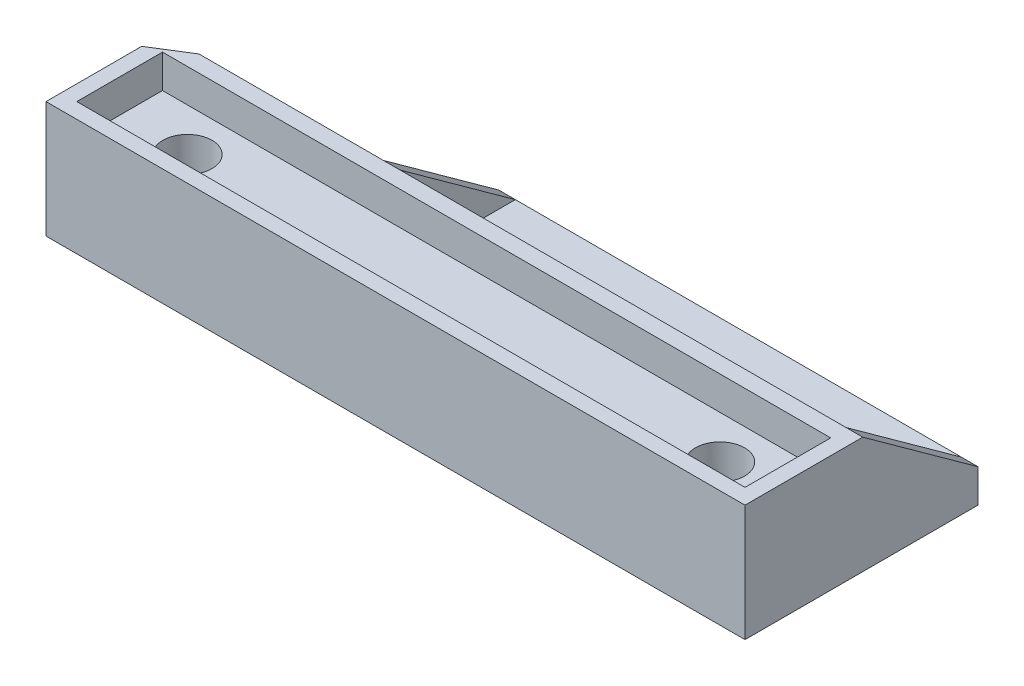
ISO-10303-21;
HEADER;
FILE_DESCRIPTION(('STEP AP214'),'2;1');
FILE_NAME('part.step','',(''),(''),'','','');
FILE_SCHEMA(('AUTOMOTIVE_DESIGN { 1 0 10303 214 1 1 1 1 }'));
ENDSEC;
DATA;
#1=APPLICATION_CONTEXT('core data for automotive mechanical design processes');
#2=APPLICATION_PROTOCOL_DEFINITION('international standard','automotive_design',2000,#1);
#3=PRODUCT_CONTEXT('',#1,'mechanical');
#4=PRODUCT('Part','Part','',(#3));
#5=PRODUCT_RELATED_PRODUCT_CATEGORY('part','',(#4));
#6=PRODUCT_DEFINITION_FORMATION('','',#4);
#7=PRODUCT_DEFINITION_CONTEXT('part definition',#1,'design');
#8=PRODUCT_DEFINITION('design','',#6,#7);
#9=PRODUCT_DEFINITION_SHAPE('','',#8);
#10=(LENGTH_UNIT() NAMED_UNIT(*) SI_UNIT(.MILLI.,.METRE.));
#11=(NAMED_UNIT(*) PLANE_ANGLE_UNIT() SI_UNIT($,.RADIAN.));
#12=(NAMED_UNIT(*) SI_UNIT($,.STERADIAN.) SOLID_ANGLE_UNIT());
#13=UNCERTAINTY_MEASURE_WITH_UNIT(LENGTH_MEASURE(1.E-05),#10,'distance_accuracy_value','');
#14=(GEOMETRIC_REPRESENTATION_CONTEXT(3) GLOBAL_UNCERTAINTY_ASSIGNED_CONTEXT((#13)) GLOBAL_UNIT_ASSIGNED_CONTEXT((#10,
#11,#12)) REPRESENTATION_CONTEXT('',''));
#15=CARTESIAN_POINT('',(0.,0.,0.));
#16=DIRECTION('',(0.,0.,1.));
#17=DIRECTION('',(1.,0.,0.));
#18=AXIS2_PLACEMENT_3D('',#15,#16,#17);
#19=CARTESIAN_POINT('',(5.,7.,-3.49999999993634));
#20=DIRECTION('',(0.,-1.,0.));
#21=DIRECTION('',(0.,0.,-1.));
#22=AXIS2_PLACEMENT_3D('',#19,#20,#21);
#23=CYLINDRICAL_SURFACE('',#22,1.47500000000001);
#24=CARTESIAN_POINT('',(5.,0.,-3.49999999993634));
#25=DIRECTION('',(0.,-1.,0.));
#26=DIRECTION('',(0.,0.,1.));
#27=AXIS2_PLACEMENT_3D('',#24,#25,#26);
#28=CIRCLE('',#27,1.47500000000001);
#29=CARTESIAN_POINT('',(5.,0.,-2.02499999993633));
#30=VERTEX_POINT('',#29);
#31=EDGE_CURVE('E249',#30,#30,#28,.T.);
#32=ORIENTED_EDGE('',*,*,#31,.T.);
#33=EDGE_LOOP('',(#32));
#34=FACE_BOUND('',#33,.T.);
#35=CARTESIAN_POINT('',(5.,5.,-3.49999999993634));
#36=DIRECTION('',(0.,1.,0.));
#37=DIRECTION('',(0.,0.,1.));
#38=AXIS2_PLACEMENT_3D('',#35,#36,#37);
#39=CIRCLE('',#38,1.47500000000001);
#40=CARTESIAN_POINT('',(5.,5.,-2.02499999993633));
#41=VERTEX_POINT('',#40);
#42=EDGE_CURVE('E245',#41,#41,#39,.F.);
#43=ORIENTED_EDGE('',*,*,#42,.F.);
#44=EDGE_LOOP('',(#43));
#45=FACE_BOUND('',#44,.T.);
#46=ADVANCED_FACE('F45',(#34,#45),#23,.F.);
#47=CARTESIAN_POINT('',(37.,7.,-3.49999999993633));
#48=DIRECTION('',(0.,-1.,0.));
#49=DIRECTION('',(0.,0.,-1.));
#50=AXIS2_PLACEMENT_3D('',#47,#48,#49);
#51=CYLINDRICAL_SURFACE('',#50,1.47500000000001);
#52=CARTESIAN_POINT('',(37.,0.,-3.49999999993633));
#53=DIRECTION('',(0.,-1.,0.));
#54=DIRECTION('',(0.,0.,-1.));
#55=AXIS2_PLACEMENT_3D('',#52,#53,#54);
#56=CIRCLE('',#55,1.47500000000001);
#57=CARTESIAN_POINT('',(37.,0.,-4.97499999993634));
#58=VERTEX_POINT('',#57);
#59=EDGE_CURVE('E250',#58,#58,#56,.T.);
#60=ORIENTED_EDGE('',*,*,#59,.T.);
#61=EDGE_LOOP('',(#60));
#62=FACE_BOUND('',#61,.T.);
#63=CARTESIAN_POINT('',(37.,5.,-3.49999999993633));
#64=DIRECTION('',(0.,1.,0.));
#65=DIRECTION('',(0.,0.,1.));
#66=AXIS2_PLACEMENT_3D('',#63,#64,#65);
#67=CIRCLE('',#66,1.47500000000001);
#68=CARTESIAN_POINT('',(37.,5.,-2.02499999993632));
#69=VERTEX_POINT('',#68);
#70=EDGE_CURVE('E235',#69,#69,#67,.F.);
#71=ORIENTED_EDGE('',*,*,#70,.F.);
#72=EDGE_LOOP('',(#71));
#73=FACE_BOUND('',#72,.T.);
#74=ADVANCED_FACE('F426',(#62,#73),#51,.F.);
#75=CARTESIAN_POINT('',(42.,7.,-6.99999999987266));
#76=DIRECTION('',(-1.,0.,0.));
#77=DIRECTION('',(0.,0.,1.));
#78=AXIS2_PLACEMENT_3D('',#75,#76,#77);
#79=PLANE('',#78);
#80=DIRECTION('',(0.,-1.,0.));
#81=VECTOR('',#80,1.);
#82=CARTESIAN_POINT('',(42.,7.,-13.9999999998727));
#83=LINE('',#82,#81);
#84=CARTESIAN_POINT('',(42.,2.,-13.9999999998727));
#85=VERTEX_POINT('',#84);
#86=CARTESIAN_POINT('',(42.,0.,-13.9999999998727));
#87=VERTEX_POINT('',#86);
#88=EDGE_CURVE('E181',#85,#87,#83,.T.);
#89=ORIENTED_EDGE('',*,*,#88,.F.);
#90=DIRECTION('',(0.,0.585383683581828,0.810756401760831));
#91=VECTOR('',#90,1.);
#92=CARTESIAN_POINT('',(42.,7.,-7.07499999987266));
#93=LINE('',#92,#91);
#94=CARTESIAN_POINT('',(42.,7.,-7.07499999987266));
#95=VERTEX_POINT('',#94);
#96=EDGE_CURVE('E161',#85,#95,#93,.T.);
#97=ORIENTED_EDGE('',*,*,#96,.T.);
#98=DIRECTION('',(0.,0.,-1.));
#99=VECTOR('',#98,1.);
#100=CARTESIAN_POINT('',(42.,7.,-6.99999999987266));
#101=LINE('',#100,#99);
#102=CARTESIAN_POINT('',(42.,7.,0.));
#103=VERTEX_POINT('',#102);
#104=EDGE_CURVE('E257',#103,#95,#101,.T.);
#105=ORIENTED_EDGE('',*,*,#104,.F.);
#106=DIRECTION('',(0.,-1.,0.));
#107=VECTOR('',#106,1.);
#108=CARTESIAN_POINT('',(42.,7.,0.));
#109=LINE('',#108,#107);
#110=CARTESIAN_POINT('',(42.,0.,0.));
#111=VERTEX_POINT('',#110);
#112=EDGE_CURVE('E270',#103,#111,#109,.T.);
#113=ORIENTED_EDGE('',*,*,#112,.T.);
#114=DIRECTION('',(0.,0.,-1.));
#115=VECTOR('',#114,1.);
#116=CARTESIAN_POINT('',(42.,0.,-6.99999999987266));
#117=LINE('',#116,#115);
#118=EDGE_CURVE('E192',#111,#87,#117,.T.);
#119=ORIENTED_EDGE('',*,*,#118,.T.);
#120=EDGE_LOOP('',(#89,#97,#105,#113,#119));
#121=FACE_BOUND('',#120,.T.);
#122=ADVANCED_FACE('F189',(#121),#79,.F.);
#123=CARTESIAN_POINT('',(0.,7.,-5.75));
#124=DIRECTION('',(0.529919264233527,0.,0.848048096156224));
#125=DIRECTION('',(0.848048096156224,0.,-0.529919264233527));
#126=AXIS2_PLACEMENT_3D('',#123,#124,#125);
#127=PLANE('',#126);
#128=DIRECTION('',(-0.848048096156224,0.,0.529919264233527));
#129=VECTOR('',#128,1.);
#130=CARTESIAN_POINT('',(0.,7.,-5.75));
#131=LINE('',#130,#129);
#132=CARTESIAN_POINT('',(2.12044325077533,7.,-7.07499999987266));
#133=VERTEX_POINT('',#132);
#134=CARTESIAN_POINT('',(0.,7.,-5.75));
#135=VERTEX_POINT('',#134);
#136=EDGE_CURVE('E260',#133,#135,#131,.T.);
#137=ORIENTED_EDGE('',*,*,#136,.F.);
#138=DIRECTION('',(0.,1.,0.));
#139=VECTOR('',#138,1.);
#140=CARTESIAN_POINT('',(2.12044325077533,2.,-7.07499999987266));
#141=LINE('',#140,#139);
#142=CARTESIAN_POINT('',(2.12044325077533,3.,-7.07499999987266));
#143=VERTEX_POINT('',#142);
#144=EDGE_CURVE('E328',#143,#133,#141,.T.);
#145=ORIENTED_EDGE('',*,*,#144,.F.);
#146=DIRECTION('',(-0.749337346632538,0.468237942152119,0.468237942152125));
#147=VECTOR('',#146,1.);
#148=CARTESIAN_POINT('',(-0.938572373960924,4.91148511091009,-5.16351488896254));
#149=LINE('',#148,#147);
#150=CARTESIAN_POINT('',(3.72077777981619,2.,-8.07499999987267));
#151=VERTEX_POINT('',#150);
#152=EDGE_CURVE('E11',#143,#151,#149,.F.);
#153=ORIENTED_EDGE('',*,*,#152,.T.);
#154=DIRECTION('',(-0.848048096156395,0.,0.529919264233255));
#155=VECTOR('',#154,1.);
#156=CARTESIAN_POINT('',(13.2027598643832,2.,-13.9999999998727));
#157=LINE('',#156,#155);
#158=CARTESIAN_POINT('',(13.2027598643832,2.,-13.9999999998727));
#159=VERTEX_POINT('',#158);
#160=EDGE_CURVE('E320',#159,#151,#157,.T.);
#161=ORIENTED_EDGE('',*,*,#160,.F.);
#162=DIRECTION('',(0.,-1.,0.));
#163=VECTOR('',#162,1.);
#164=CARTESIAN_POINT('',(13.2027598643832,7.,-13.9999999998727));
#165=LINE('',#164,#163);
#166=CARTESIAN_POINT('',(13.2027598643832,0.,-13.9999999998727));
#167=VERTEX_POINT('',#166);
#168=EDGE_CURVE('E196',#159,#167,#165,.T.);
#169=ORIENTED_EDGE('',*,*,#168,.T.);
#170=DIRECTION('',(-0.848048096156224,0.,0.529919264233527));
#171=VECTOR('',#170,1.);
#172=CARTESIAN_POINT('',(0.,0.,-5.75));
#173=LINE('',#172,#171);
#174=CARTESIAN_POINT('',(0.,0.,-5.75));
#175=VERTEX_POINT('',#174);
#176=EDGE_CURVE('E273',#167,#175,#173,.T.);
#177=ORIENTED_EDGE('',*,*,#176,.T.);
#178=DIRECTION('',(0.,-1.,0.));
#179=VECTOR('',#178,1.);
#180=CARTESIAN_POINT('',(0.,7.,-5.75));
#181=LINE('',#180,#179);
#182=EDGE_CURVE('E287',#135,#175,#181,.T.);
#183=ORIENTED_EDGE('',*,*,#182,.F.);
#184=EDGE_LOOP('',(#137,#145,#153,#161,#169,#177,#183));
#185=FACE_BOUND('',#184,.T.);
#186=ADVANCED_FACE('F396',(#185),#127,.F.);
#187=CARTESIAN_POINT('',(0.,7.,-5.75));
#188=DIRECTION('',(1.,0.,0.));
#189=DIRECTION('',(0.,0.,-1.));
#190=AXIS2_PLACEMENT_3D('',#187,#188,#189);
#191=PLANE('',#190);
#192=DIRECTION('',(0.,0.,1.));
#193=VECTOR('',#192,1.);
#194=CARTESIAN_POINT('',(0.,0.,-5.75));
#195=LINE('',#194,#193);
#196=CARTESIAN_POINT('',(0.,0.,0.));
#197=VERTEX_POINT('',#196);
#198=EDGE_CURVE('E276',#175,#197,#195,.T.);
#199=ORIENTED_EDGE('',*,*,#198,.T.);
#200=DIRECTION('',(0.,-1.,0.));
#201=VECTOR('',#200,1.);
#202=CARTESIAN_POINT('',(0.,7.,0.));
#203=LINE('',#202,#201);
#204=CARTESIAN_POINT('',(0.,7.,0.));
#205=VERTEX_POINT('',#204);
#206=EDGE_CURVE('E283',#205,#197,#203,.T.);
#207=ORIENTED_EDGE('',*,*,#206,.F.);
#208=DIRECTION('',(0.,0.,1.));
#209=VECTOR('',#208,1.);
#210=CARTESIAN_POINT('',(0.,7.,-5.75));
#211=LINE('',#210,#209);
#212=EDGE_CURVE('E264',#135,#205,#211,.T.);
#213=ORIENTED_EDGE('',*,*,#212,.F.);
#214=ORIENTED_EDGE('',*,*,#182,.T.);
#215=EDGE_LOOP('',(#199,#207,#213,#214));
#216=FACE_BOUND('',#215,.T.);
#217=ADVANCED_FACE('F402',(#216),#191,.F.);
#218=CARTESIAN_POINT('',(0.,7.,0.));
#219=DIRECTION('',(0.,0.,-1.));
#220=DIRECTION('',(-1.,0.,0.));
#221=AXIS2_PLACEMENT_3D('',#218,#219,#220);
#222=PLANE('',#221);
#223=DIRECTION('',(1.,0.,0.));
#224=VECTOR('',#223,1.);
#225=CARTESIAN_POINT('',(0.,0.,0.));
#226=LINE('',#225,#224);
#227=EDGE_CURVE('E261',#197,#111,#226,.T.);
#228=ORIENTED_EDGE('',*,*,#227,.T.);
#229=ORIENTED_EDGE('',*,*,#112,.F.);
#230=DIRECTION('',(1.,0.,0.));
#231=VECTOR('',#230,1.);
#232=CARTESIAN_POINT('',(0.,7.,0.));
#233=LINE('',#232,#231);
#234=EDGE_CURVE('E267',#205,#103,#233,.T.);
#235=ORIENTED_EDGE('',*,*,#234,.F.);
#236=ORIENTED_EDGE('',*,*,#206,.T.);
#237=EDGE_LOOP('',(#228,#229,#235,#236));
#238=FACE_BOUND('',#237,.T.);
#239=ADVANCED_FACE('F406',(#238),#222,.F.);
#240=CARTESIAN_POINT('',(0.,7.,0.));
#241=DIRECTION('',(0.,1.,0.));
#242=DIRECTION('',(0.,0.,1.));
#243=AXIS2_PLACEMENT_3D('',#240,#241,#242);
#244=PLANE('',#243);
#245=DIRECTION('',(-1.,0.,0.));
#246=VECTOR('',#245,1.);
#247=CARTESIAN_POINT('',(42.,7.,-7.07499999987266));
#248=LINE('',#247,#246);
#249=CARTESIAN_POINT('',(14.2027598643832,7.,-7.07499999987266));
#250=VERTEX_POINT('',#249);
#251=CARTESIAN_POINT('',(13.2027598643832,7.,-7.07499999987266));
#252=VERTEX_POINT('',#251);
#253=EDGE_CURVE('E187',#250,#252,#248,.T.);
#254=ORIENTED_EDGE('',*,*,#253,.T.);
#255=DIRECTION('',(1.,0.,0.));
#256=VECTOR('',#255,1.);
#257=CARTESIAN_POINT('',(2.12044325077533,7.,-7.07499999987266));
#258=LINE('',#257,#256);
#259=EDGE_CURVE('E332',#133,#252,#258,.T.);
#260=ORIENTED_EDGE('',*,*,#259,.F.);
#261=ORIENTED_EDGE('',*,*,#136,.T.);
#262=ORIENTED_EDGE('',*,*,#212,.T.);
#263=ORIENTED_EDGE('',*,*,#234,.T.);
#264=ORIENTED_EDGE('',*,*,#104,.T.);
#265=CARTESIAN_POINT('',(41.,7.,-7.07499999987266));
#266=VERTEX_POINT('',#265);
#267=EDGE_CURVE('E168',#95,#266,#248,.T.);
#268=ORIENTED_EDGE('',*,*,#267,.T.);
#269=DIRECTION('',(1.,0.,0.));
#270=VECTOR('',#269,1.);
#271=CARTESIAN_POINT('',(41.,7.,-7.07499999987266));
#272=LINE('',#271,#270);
#273=EDGE_CURVE('E351',#250,#266,#272,.T.);
#274=ORIENTED_EDGE('',*,*,#273,.F.);
#275=EDGE_LOOP('',(#254,#260,#261,#262,#263,#264,#268,#274));
#276=FACE_BOUND('',#275,.T.);
#277=DIRECTION('',(0.,0.,1.));
#278=VECTOR('',#277,1.);
#279=CARTESIAN_POINT('',(0.925000000000002,7.,-6.07499999987266));
#280=LINE('',#279,#278);
#281=CARTESIAN_POINT('',(0.925000000000002,7.,-6.07499999987266));
#282=VERTEX_POINT('',#281);
#283=CARTESIAN_POINT('',(0.925000000000003,7.,-0.924999999872662));
#284=VERTEX_POINT('',#283);
#285=EDGE_CURVE('E195',#282,#284,#280,.T.);
#286=ORIENTED_EDGE('',*,*,#285,.F.);
#287=DIRECTION('',(1.,0.,0.));
#288=VECTOR('',#287,1.);
#289=CARTESIAN_POINT('',(0.925000000000002,7.,-6.07499999987266));
#290=LINE('',#289,#288);
#291=CARTESIAN_POINT('',(41.075,7.,-6.07499999987266));
#292=VERTEX_POINT('',#291);
#293=EDGE_CURVE('E211',#282,#292,#290,.T.);
#294=ORIENTED_EDGE('',*,*,#293,.T.);
#295=DIRECTION('',(0.,0.,1.));
#296=VECTOR('',#295,1.);
#297=CARTESIAN_POINT('',(41.075,7.,-6.07499999987266));
#298=LINE('',#297,#296);
#299=CARTESIAN_POINT('',(41.075,7.,-0.924999999872662));
#300=VERTEX_POINT('',#299);
#301=EDGE_CURVE('E225',#292,#300,#298,.T.);
#302=ORIENTED_EDGE('',*,*,#301,.T.);
#303=DIRECTION('',(1.,0.,0.));
#304=VECTOR('',#303,1.);
#305=CARTESIAN_POINT('',(0.925000000000003,7.,-0.924999999872662));
#306=LINE('',#305,#304);
#307=EDGE_CURVE('E200',#284,#300,#306,.T.);
#308=ORIENTED_EDGE('',*,*,#307,.F.);
#309=EDGE_LOOP('',(#286,#294,#302,#308));
#310=FACE_BOUND('',#309,.T.);
#311=ADVANCED_FACE('F392',(#276,#310),#244,.T.);
#312=CARTESIAN_POINT('',(0.,0.,0.));
#313=DIRECTION('',(0.,1.,0.));
#314=DIRECTION('',(0.,0.,1.));
#315=AXIS2_PLACEMENT_3D('',#312,#313,#314);
#316=PLANE('',#315);
#317=ORIENTED_EDGE('',*,*,#59,.F.);
#318=EDGE_LOOP('',(#317));
#319=FACE_BOUND('',#318,.T.);
#320=ORIENTED_EDGE('',*,*,#31,.F.);
#321=EDGE_LOOP('',(#320));
#322=FACE_BOUND('',#321,.T.);
#323=ORIENTED_EDGE('',*,*,#118,.F.);
#324=ORIENTED_EDGE('',*,*,#227,.F.);
#325=ORIENTED_EDGE('',*,*,#198,.F.);
#326=ORIENTED_EDGE('',*,*,#176,.F.);
#327=DIRECTION('',(-1.,0.,0.));
#328=VECTOR('',#327,1.);
#329=CARTESIAN_POINT('',(42.,0.,-13.9999999998727));
#330=LINE('',#329,#328);
#331=EDGE_CURVE('E202',#87,#167,#330,.T.);
#332=ORIENTED_EDGE('',*,*,#331,.F.);
#333=EDGE_LOOP('',(#323,#324,#325,#326,#332));
#334=FACE_BOUND('',#333,.T.);
#335=ADVANCED_FACE('F409',(#319,#322,#334),#316,.F.);
#336=CARTESIAN_POINT('',(0.,5.,0.));
#337=DIRECTION('',(0.,1.,0.));
#338=DIRECTION('',(0.,0.,1.));
#339=AXIS2_PLACEMENT_3D('',#336,#337,#338);
#340=PLANE('',#339);
#341=DIRECTION('',(0.,0.,1.));
#342=VECTOR('',#341,1.);
#343=CARTESIAN_POINT('',(0.925000000000002,5.,-6.07499999987266));
#344=LINE('',#343,#342);
#345=CARTESIAN_POINT('',(0.925000000000002,5.,-6.07499999987266));
#346=VERTEX_POINT('',#345);
#347=CARTESIAN_POINT('',(0.925000000000003,5.,-0.924999999872662));
#348=VERTEX_POINT('',#347);
#349=EDGE_CURVE('E206',#346,#348,#344,.T.);
#350=ORIENTED_EDGE('',*,*,#349,.T.);
#351=DIRECTION('',(1.,0.,0.));
#352=VECTOR('',#351,1.);
#353=CARTESIAN_POINT('',(0.925000000000003,5.,-0.924999999872662));
#354=LINE('',#353,#352);
#355=CARTESIAN_POINT('',(41.075,5.,-0.924999999872662));
#356=VERTEX_POINT('',#355);
#357=EDGE_CURVE('E210',#348,#356,#354,.T.);
#358=ORIENTED_EDGE('',*,*,#357,.T.);
#359=DIRECTION('',(0.,0.,1.));
#360=VECTOR('',#359,1.);
#361=CARTESIAN_POINT('',(41.075,5.,-6.07499999987266));
#362=LINE('',#361,#360);
#363=CARTESIAN_POINT('',(41.075,5.,-6.07499999987266));
#364=VERTEX_POINT('',#363);
#365=EDGE_CURVE('E215',#364,#356,#362,.T.);
#366=ORIENTED_EDGE('',*,*,#365,.F.);
#367=DIRECTION('',(1.,0.,0.));
#368=VECTOR('',#367,1.);
#369=CARTESIAN_POINT('',(0.925000000000002,5.,-6.07499999987266));
#370=LINE('',#369,#368);
#371=EDGE_CURVE('E218',#346,#364,#370,.T.);
#372=ORIENTED_EDGE('',*,*,#371,.F.);
#373=EDGE_LOOP('',(#350,#358,#366,#372));
#374=FACE_BOUND('',#373,.T.);
#375=ORIENTED_EDGE('',*,*,#70,.T.);
#376=EDGE_LOOP('',(#375));
#377=FACE_BOUND('',#376,.T.);
#378=ORIENTED_EDGE('',*,*,#42,.T.);
#379=EDGE_LOOP('',(#378));
#380=FACE_BOUND('',#379,.T.);
#381=ADVANCED_FACE('F411',(#374,#377,#380),#340,.T.);
#382=CARTESIAN_POINT('',(0.925000000000002,5.,-6.07499999987266));
#383=DIRECTION('',(-1.,0.,0.));
#384=DIRECTION('',(0.,0.,1.));
#385=AXIS2_PLACEMENT_3D('',#382,#383,#384);
#386=PLANE('',#385);
#387=ORIENTED_EDGE('',*,*,#285,.T.);
#388=DIRECTION('',(0.,1.,0.));
#389=VECTOR('',#388,1.);
#390=CARTESIAN_POINT('',(0.925000000000003,5.,-0.924999999872662));
#391=LINE('',#390,#389);
#392=EDGE_CURVE('E220',#348,#284,#391,.T.);
#393=ORIENTED_EDGE('',*,*,#392,.F.);
#394=ORIENTED_EDGE('',*,*,#349,.F.);
#395=DIRECTION('',(0.,1.,0.));
#396=VECTOR('',#395,1.);
#397=CARTESIAN_POINT('',(0.925000000000002,5.,-6.07499999987266));
#398=LINE('',#397,#396);
#399=EDGE_CURVE('E232',#346,#282,#398,.T.);
#400=ORIENTED_EDGE('',*,*,#399,.T.);
#401=EDGE_LOOP('',(#387,#393,#394,#400));
#402=FACE_BOUND('',#401,.T.);
#403=ADVANCED_FACE('F418',(#402),#386,.F.);
#404=CARTESIAN_POINT('',(0.925000000000002,5.,-6.07499999987266));
#405=DIRECTION('',(0.,0.,1.));
#406=DIRECTION('',(1.,0.,0.));
#407=AXIS2_PLACEMENT_3D('',#404,#405,#406);
#408=PLANE('',#407);
#409=ORIENTED_EDGE('',*,*,#293,.F.);
#410=ORIENTED_EDGE('',*,*,#399,.F.);
#411=ORIENTED_EDGE('',*,*,#371,.T.);
#412=DIRECTION('',(0.,1.,0.));
#413=VECTOR('',#412,1.);
#414=CARTESIAN_POINT('',(41.075,5.,-6.07499999987266));
#415=LINE('',#414,#413);
#416=EDGE_CURVE('E236',#364,#292,#415,.T.);
#417=ORIENTED_EDGE('',*,*,#416,.T.);
#418=EDGE_LOOP('',(#409,#410,#411,#417));
#419=FACE_BOUND('',#418,.T.);
#420=ADVANCED_FACE('F438',(#419),#408,.T.);
#421=CARTESIAN_POINT('',(41.075,5.,-6.07499999987266));
#422=DIRECTION('',(-1.,0.,0.));
#423=DIRECTION('',(0.,0.,1.));
#424=AXIS2_PLACEMENT_3D('',#421,#422,#423);
#425=PLANE('',#424);
#426=ORIENTED_EDGE('',*,*,#301,.F.);
#427=ORIENTED_EDGE('',*,*,#416,.F.);
#428=ORIENTED_EDGE('',*,*,#365,.T.);
#429=DIRECTION('',(0.,1.,0.));
#430=VECTOR('',#429,1.);
#431=CARTESIAN_POINT('',(41.075,5.,-0.924999999872662));
#432=LINE('',#431,#430);
#433=EDGE_CURVE('E239',#356,#300,#432,.T.);
#434=ORIENTED_EDGE('',*,*,#433,.T.);
#435=EDGE_LOOP('',(#426,#427,#428,#434));
#436=FACE_BOUND('',#435,.T.);
#437=ADVANCED_FACE('F443',(#436),#425,.T.);
#438=CARTESIAN_POINT('',(0.925000000000003,5.,-0.924999999872662));
#439=DIRECTION('',(0.,0.,1.));
#440=DIRECTION('',(1.,0.,0.));
#441=AXIS2_PLACEMENT_3D('',#438,#439,#440);
#442=PLANE('',#441);
#443=ORIENTED_EDGE('',*,*,#307,.T.);
#444=ORIENTED_EDGE('',*,*,#433,.F.);
#445=ORIENTED_EDGE('',*,*,#357,.F.);
#446=ORIENTED_EDGE('',*,*,#392,.T.);
#447=EDGE_LOOP('',(#443,#444,#445,#446));
#448=FACE_BOUND('',#447,.T.);
#449=ADVANCED_FACE('F440',(#448),#442,.F.);
#450=CARTESIAN_POINT('',(42.,7.,-13.9999999998727));
#451=DIRECTION('',(0.,0.,1.));
#452=DIRECTION('',(1.,0.,0.));
#453=AXIS2_PLACEMENT_3D('',#450,#451,#452);
#454=PLANE('',#453);
#455=ORIENTED_EDGE('',*,*,#168,.F.);
#456=DIRECTION('',(-1.,0.,0.));
#457=VECTOR('',#456,1.);
#458=CARTESIAN_POINT('',(42.,2.,-13.9999999998727));
#459=LINE('',#458,#457);
#460=CARTESIAN_POINT('',(14.2027598643832,2.,-13.9999999998727));
#461=VERTEX_POINT('',#460);
#462=EDGE_CURVE('E174',#461,#159,#459,.T.);
#463=ORIENTED_EDGE('',*,*,#462,.F.);
#464=DIRECTION('',(-1.,0.,0.));
#465=VECTOR('',#464,1.);
#466=CARTESIAN_POINT('',(14.2027598643832,2.,-13.9999999998727));
#467=LINE('',#466,#465);
#468=CARTESIAN_POINT('',(41.,2.,-13.9999999998727));
#469=VERTEX_POINT('',#468);
#470=EDGE_CURVE('E185',#469,#461,#467,.T.);
#471=ORIENTED_EDGE('',*,*,#470,.F.);
#472=EDGE_CURVE('E165',#85,#469,#459,.T.);
#473=ORIENTED_EDGE('',*,*,#472,.F.);
#474=ORIENTED_EDGE('',*,*,#88,.T.);
#475=ORIENTED_EDGE('',*,*,#331,.T.);
#476=EDGE_LOOP('',(#455,#463,#471,#473,#474,#475));
#477=FACE_BOUND('',#476,.T.);
#478=ADVANCED_FACE('F179',(#477),#454,.F.);
#479=CARTESIAN_POINT('',(13.2027598643832,2.,-7.07499999987266));
#480=DIRECTION('',(1.,0.,0.));
#481=DIRECTION('',(0.,0.,-1.));
#482=AXIS2_PLACEMENT_3D('',#479,#480,#481);
#483=PLANE('',#482);
#484=DIRECTION('',(0.,0.,-1.));
#485=VECTOR('',#484,1.);
#486=CARTESIAN_POINT('',(13.2027598643832,2.,-7.07499999987266));
#487=LINE('',#486,#485);
#488=CARTESIAN_POINT('',(13.2027598643832,2.,-8.07499999987267));
#489=VERTEX_POINT('',#488);
#490=EDGE_CURVE('E317',#489,#159,#487,.T.);
#491=ORIENTED_EDGE('',*,*,#490,.F.);
#492=DIRECTION('',(0.,-0.707106781186543,-0.707106781186552));
#493=VECTOR('',#492,1.);
#494=CARTESIAN_POINT('',(13.2027598643832,2.,-8.07499999987267));
#495=LINE('',#494,#493);
#496=CARTESIAN_POINT('',(13.2027598643832,3.,-7.07499999987266));
#497=VERTEX_POINT('',#496);
#498=EDGE_CURVE('E69',#489,#497,#495,.F.);
#499=ORIENTED_EDGE('',*,*,#498,.T.);
#500=DIRECTION('',(0.,1.,0.));
#501=VECTOR('',#500,1.);
#502=CARTESIAN_POINT('',(13.2027598643832,2.,-7.07499999987266));
#503=LINE('',#502,#501);
#504=EDGE_CURVE('E334',#497,#252,#503,.T.);
#505=ORIENTED_EDGE('',*,*,#504,.T.);
#506=DIRECTION('',(0.,-0.585383683581828,-0.810756401760832));
#507=VECTOR('',#506,1.);
#508=CARTESIAN_POINT('',(13.2027598643832,5.28662971498086,-9.44801784462418));
#509=LINE('',#508,#507);
#510=EDGE_CURVE('E326',#252,#159,#509,.T.);
#511=ORIENTED_EDGE('',*,*,#510,.T.);
#512=EDGE_LOOP('',(#491,#499,#505,#511));
#513=FACE_BOUND('',#512,.T.);
#514=ADVANCED_FACE('F324',(#513),#483,.F.);
#515=CARTESIAN_POINT('',(2.12044325077533,2.,-7.07499999987266));
#516=DIRECTION('',(0.,0.,1.));
#517=DIRECTION('',(1.,0.,0.));
#518=AXIS2_PLACEMENT_3D('',#515,#516,#517);
#519=PLANE('',#518);
#520=ORIENTED_EDGE('',*,*,#504,.F.);
#521=DIRECTION('',(-1.,0.,0.));
#522=VECTOR('',#521,1.);
#523=CARTESIAN_POINT('',(2.12044325077533,3.,-7.07499999987266));
#524=LINE('',#523,#522);
#525=EDGE_CURVE('E55',#497,#143,#524,.T.);
#526=ORIENTED_EDGE('',*,*,#525,.T.);
#527=ORIENTED_EDGE('',*,*,#144,.T.);
#528=ORIENTED_EDGE('',*,*,#259,.T.);
#529=EDGE_LOOP('',(#520,#526,#527,#528));
#530=FACE_BOUND('',#529,.T.);
#531=ADVANCED_FACE('F390',(#530),#519,.F.);
#532=CARTESIAN_POINT('',(0.,2.,0.));
#533=DIRECTION('',(0.,-1.,0.));
#534=DIRECTION('',(0.,0.,-1.));
#535=AXIS2_PLACEMENT_3D('',#532,#533,#534);
#536=PLANE('',#535);
#537=ORIENTED_EDGE('',*,*,#160,.T.);
#538=DIRECTION('',(1.,0.,0.));
#539=VECTOR('',#538,1.);
#540=CARTESIAN_POINT('',(13.2027598643832,2.,-8.07499999987267));
#541=LINE('',#540,#539);
#542=EDGE_CURVE('E307',#151,#489,#541,.T.);
#543=ORIENTED_EDGE('',*,*,#542,.T.);
#544=ORIENTED_EDGE('',*,*,#490,.T.);
#545=EDGE_LOOP('',(#537,#543,#544));
#546=FACE_BOUND('',#545,.T.);
#547=ADVANCED_FACE('F316',(#546),#536,.F.);
#548=CARTESIAN_POINT('',(41.,2.,-7.07499999987266));
#549=DIRECTION('',(0.,0.,1.));
#550=DIRECTION('',(1.,0.,0.));
#551=AXIS2_PLACEMENT_3D('',#548,#549,#550);
#552=PLANE('',#551);
#553=DIRECTION('',(0.,1.,0.));
#554=VECTOR('',#553,1.);
#555=CARTESIAN_POINT('',(41.,2.,-7.07499999987266));
#556=LINE('',#555,#554);
#557=CARTESIAN_POINT('',(41.,2.99999999999999,-7.07499999987266));
#558=VERTEX_POINT('',#557);
#559=EDGE_CURVE('E341',#558,#266,#556,.T.);
#560=ORIENTED_EDGE('',*,*,#559,.F.);
#561=DIRECTION('',(-1.,0.,0.));
#562=VECTOR('',#561,1.);
#563=CARTESIAN_POINT('',(14.2027598643832,2.99999999999999,-7.07499999987266));
#564=LINE('',#563,#562);
#565=CARTESIAN_POINT('',(14.2027598643832,2.99999999999999,-7.07499999987266));
#566=VERTEX_POINT('',#565);
#567=EDGE_CURVE('E301',#558,#566,#564,.T.);
#568=ORIENTED_EDGE('',*,*,#567,.T.);
#569=DIRECTION('',(0.,1.,0.));
#570=VECTOR('',#569,1.);
#571=CARTESIAN_POINT('',(14.2027598643832,2.,-7.07499999987266));
#572=LINE('',#571,#570);
#573=EDGE_CURVE('E339',#566,#250,#572,.T.);
#574=ORIENTED_EDGE('',*,*,#573,.T.);
#575=ORIENTED_EDGE('',*,*,#273,.T.);
#576=EDGE_LOOP('',(#560,#568,#574,#575));
#577=FACE_BOUND('',#576,.T.);
#578=ADVANCED_FACE('F382',(#577),#552,.F.);
#579=CARTESIAN_POINT('',(14.2027598643832,2.,-7.07499999987266));
#580=DIRECTION('',(-1.,0.,0.));
#581=DIRECTION('',(0.,0.,1.));
#582=AXIS2_PLACEMENT_3D('',#579,#580,#581);
#583=PLANE('',#582);
#584=ORIENTED_EDGE('',*,*,#573,.F.);
#585=DIRECTION('',(0.,0.707106781186542,0.707106781186553));
#586=VECTOR('',#585,1.);
#587=CARTESIAN_POINT('',(14.2027598643832,2.,-8.07499999987266));
#588=LINE('',#587,#586);
#589=CARTESIAN_POINT('',(14.2027598643832,2.,-8.07499999987267));
#590=VERTEX_POINT('',#589);
#591=EDGE_CURVE('E304',#566,#590,#588,.F.);
#592=ORIENTED_EDGE('',*,*,#591,.T.);
#593=DIRECTION('',(0.,0.,1.));
#594=VECTOR('',#593,1.);
#595=CARTESIAN_POINT('',(14.2027598643832,2.,-7.07499999987266));
#596=LINE('',#595,#594);
#597=EDGE_CURVE('E348',#461,#590,#596,.T.);
#598=ORIENTED_EDGE('',*,*,#597,.F.);
#599=DIRECTION('',(0.,0.585383683581828,0.810756401760832));
#600=VECTOR('',#599,1.);
#601=CARTESIAN_POINT('',(14.2027598643832,5.28662971498086,-9.44801784462418));
#602=LINE('',#601,#600);
#603=EDGE_CURVE('E355',#461,#250,#602,.T.);
#604=ORIENTED_EDGE('',*,*,#603,.T.);
#605=EDGE_LOOP('',(#584,#592,#598,#604));
#606=FACE_BOUND('',#605,.T.);
#607=ADVANCED_FACE('F461',(#606),#583,.F.);
#608=CARTESIAN_POINT('',(41.,2.,-13.9999999998727));
#609=DIRECTION('',(1.,0.,0.));
#610=DIRECTION('',(0.,0.,-1.));
#611=AXIS2_PLACEMENT_3D('',#608,#609,#610);
#612=PLANE('',#611);
#613=DIRECTION('',(0.,0.,-1.));
#614=VECTOR('',#613,1.);
#615=CARTESIAN_POINT('',(41.,2.,-13.9999999998727));
#616=LINE('',#615,#614);
#617=CARTESIAN_POINT('',(41.,2.,-8.07499999987267));
#618=VERTEX_POINT('',#617);
#619=EDGE_CURVE('E363',#618,#469,#616,.T.);
#620=ORIENTED_EDGE('',*,*,#619,.F.);
#621=DIRECTION('',(0.,-0.707106781186542,-0.707106781186553));
#622=VECTOR('',#621,1.);
#623=CARTESIAN_POINT('',(41.,2.,-8.07499999987267));
#624=LINE('',#623,#622);
#625=EDGE_CURVE('E298',#618,#558,#624,.F.);
#626=ORIENTED_EDGE('',*,*,#625,.T.);
#627=ORIENTED_EDGE('',*,*,#559,.T.);
#628=DIRECTION('',(0.,-0.585383683581828,-0.810756401760832));
#629=VECTOR('',#628,1.);
#630=CARTESIAN_POINT('',(41.,2.,-13.9999999998727));
#631=LINE('',#630,#629);
#632=EDGE_CURVE('E359',#266,#469,#631,.T.);
#633=ORIENTED_EDGE('',*,*,#632,.T.);
#634=EDGE_LOOP('',(#620,#626,#627,#633));
#635=FACE_BOUND('',#634,.T.);
#636=ADVANCED_FACE('F381',(#635),#612,.F.);
#637=CARTESIAN_POINT('',(0.,2.,0.));
#638=DIRECTION('',(0.,-1.,0.));
#639=DIRECTION('',(0.,0.,-1.));
#640=AXIS2_PLACEMENT_3D('',#637,#638,#639);
#641=PLANE('',#640);
#642=ORIENTED_EDGE('',*,*,#597,.T.);
#643=DIRECTION('',(1.,0.,0.));
#644=VECTOR('',#643,1.);
#645=CARTESIAN_POINT('',(41.,2.,-8.07499999987267));
#646=LINE('',#645,#644);
#647=EDGE_CURVE('E291',#590,#618,#646,.T.);
#648=ORIENTED_EDGE('',*,*,#647,.T.);
#649=ORIENTED_EDGE('',*,*,#619,.T.);
#650=ORIENTED_EDGE('',*,*,#470,.T.);
#651=EDGE_LOOP('',(#642,#648,#649,#650));
#652=FACE_BOUND('',#651,.T.);
#653=ADVANCED_FACE('F372',(#652),#641,.F.);
#654=CARTESIAN_POINT('',(42.,7.,-7.07499999987266));
#655=DIRECTION('',(0.,-0.810756401760831,0.585383683581828));
#656=DIRECTION('',(0.,-0.585383683581828,-0.810756401760832));
#657=AXIS2_PLACEMENT_3D('',#654,#655,#656);
#658=PLANE('',#657);
#659=ORIENTED_EDGE('',*,*,#267,.F.);
#660=ORIENTED_EDGE('',*,*,#96,.F.);
#661=ORIENTED_EDGE('',*,*,#472,.T.);
#662=ORIENTED_EDGE('',*,*,#632,.F.);
#663=EDGE_LOOP('',(#659,#660,#661,#662));
#664=FACE_BOUND('',#663,.T.);
#665=ADVANCED_FACE('F163',(#664),#658,.F.);
#666=ORIENTED_EDGE('',*,*,#253,.F.);
#667=ORIENTED_EDGE('',*,*,#603,.F.);
#668=ORIENTED_EDGE('',*,*,#462,.T.);
#669=ORIENTED_EDGE('',*,*,#510,.F.);
#670=EDGE_LOOP('',(#666,#667,#668,#669));
#671=FACE_BOUND('',#670,.T.);
#672=ADVANCED_FACE('F468',(#671),#658,.F.);
#673=CARTESIAN_POINT('',(0.,2.,-8.07499999987266));
#674=DIRECTION('',(0.,0.707106781186553,-0.707106781186542));
#675=DIRECTION('',(-1.,0.,0.));
#676=AXIS2_PLACEMENT_3D('',#673,#674,#675);
#677=PLANE('',#676);
#678=ORIENTED_EDGE('',*,*,#591,.F.);
#679=ORIENTED_EDGE('',*,*,#567,.F.);
#680=ORIENTED_EDGE('',*,*,#625,.F.);
#681=ORIENTED_EDGE('',*,*,#647,.F.);
#682=EDGE_LOOP('',(#678,#679,#680,#681));
#683=FACE_BOUND('',#682,.T.);
#684=ADVANCED_FACE('F377',(#683),#677,.T.);
#685=CARTESIAN_POINT('',(0.,2.,-8.07499999987267));
#686=DIRECTION('',(0.,0.707106781186552,-0.707106781186542));
#687=DIRECTION('',(-1.,0.,0.));
#688=AXIS2_PLACEMENT_3D('',#685,#686,#687);
#689=PLANE('',#688);
#690=ORIENTED_EDGE('',*,*,#152,.F.);
#691=ORIENTED_EDGE('',*,*,#525,.F.);
#692=ORIENTED_EDGE('',*,*,#498,.F.);
#693=ORIENTED_EDGE('',*,*,#542,.F.);
#694=EDGE_LOOP('',(#690,#691,#692,#693));
#695=FACE_BOUND('',#694,.T.);
#696=ADVANCED_FACE('F48',(#695),#689,.T.);
#697=CLOSED_SHELL('',(#46,#74,#122,#186,#217,#239,#311,#335,#381,#403,#420,#437,#449,#478,#514,
#531,#547,#578,#607,#636,#653,#665,#672,#684,#696));
#698=MANIFOLD_SOLID_BREP('B2',#697);
#699=ADVANCED_BREP_SHAPE_REPRESENTATION('',(#18,#698),#14);
#700=SHAPE_DEFINITION_REPRESENTATION(#9,#699);
ENDSEC;
END-ISO-10303-21;
